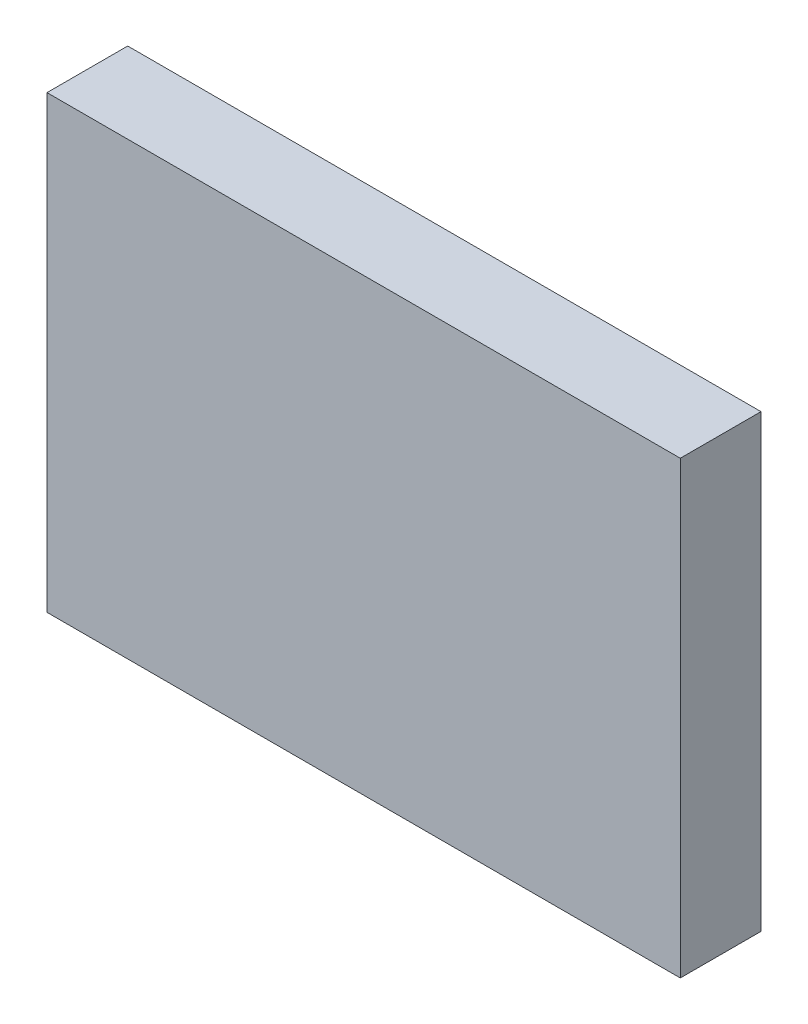
ISO-10303-21;
HEADER;
FILE_DESCRIPTION(('STEP AP214'),'2;1');
FILE_NAME('part.step','',(''),(''),'','','');
FILE_SCHEMA(('AUTOMOTIVE_DESIGN { 1 0 10303 214 1 1 1 1 }'));
ENDSEC;
DATA;
#1=APPLICATION_CONTEXT('core data for automotive mechanical design processes');
#2=APPLICATION_PROTOCOL_DEFINITION('international standard','automotive_design',2000,#1);
#3=PRODUCT_CONTEXT('',#1,'mechanical');
#4=PRODUCT('Part','Part','',(#3));
#5=PRODUCT_RELATED_PRODUCT_CATEGORY('part','',(#4));
#6=PRODUCT_DEFINITION_FORMATION('','',#4);
#7=PRODUCT_DEFINITION_CONTEXT('part definition',#1,'design');
#8=PRODUCT_DEFINITION('design','',#6,#7);
#9=PRODUCT_DEFINITION_SHAPE('','',#8);
#10=(LENGTH_UNIT() NAMED_UNIT(*) SI_UNIT(.MILLI.,.METRE.));
#11=(NAMED_UNIT(*) PLANE_ANGLE_UNIT() SI_UNIT($,.RADIAN.));
#12=(NAMED_UNIT(*) SI_UNIT($,.STERADIAN.) SOLID_ANGLE_UNIT());
#13=UNCERTAINTY_MEASURE_WITH_UNIT(LENGTH_MEASURE(1.E-05),#10,'distance_accuracy_value','');
#14=(GEOMETRIC_REPRESENTATION_CONTEXT(3) GLOBAL_UNCERTAINTY_ASSIGNED_CONTEXT((#13)) GLOBAL_UNIT_ASSIGNED_CONTEXT((#10,
#11,#12)) REPRESENTATION_CONTEXT('',''));
#15=CARTESIAN_POINT('',(0.,0.,0.));
#16=DIRECTION('',(0.,0.,1.));
#17=DIRECTION('',(1.,0.,0.));
#18=AXIS2_PLACEMENT_3D('',#15,#16,#17);
#19=CARTESIAN_POINT('',(0.,0.,2.6));
#20=DIRECTION('',(-1.,0.,0.));
#21=DIRECTION('',(0.,0.,1.));
#22=AXIS2_PLACEMENT_3D('',#19,#20,#21);
#23=PLANE('',#22);
#24=DIRECTION('',(0.,1.,0.));
#25=VECTOR('',#24,1.);
#26=CARTESIAN_POINT('',(0.,0.,0.));
#27=LINE('',#26,#25);
#28=CARTESIAN_POINT('',(0.,0.,0.));
#29=VERTEX_POINT('',#28);
#30=CARTESIAN_POINT('',(0.,14.5,0.));
#31=VERTEX_POINT('',#30);
#32=EDGE_CURVE('E96',#29,#31,#27,.T.);
#33=ORIENTED_EDGE('',*,*,#32,.T.);
#34=DIRECTION('',(0.,0.,-1.));
#35=VECTOR('',#34,1.);
#36=CARTESIAN_POINT('',(0.,14.5,2.6));
#37=LINE('',#36,#35);
#38=CARTESIAN_POINT('',(0.,14.5,2.6));
#39=VERTEX_POINT('',#38);
#40=EDGE_CURVE('E11',#39,#31,#37,.T.);
#41=ORIENTED_EDGE('',*,*,#40,.F.);
#42=DIRECTION('',(0.,1.,0.));
#43=VECTOR('',#42,1.);
#44=CARTESIAN_POINT('',(0.,0.,2.6));
#45=LINE('',#44,#43);
#46=CARTESIAN_POINT('',(0.,0.,2.6));
#47=VERTEX_POINT('',#46);
#48=EDGE_CURVE('E84',#47,#39,#45,.T.);
#49=ORIENTED_EDGE('',*,*,#48,.F.);
#50=DIRECTION('',(0.,0.,-1.));
#51=VECTOR('',#50,1.);
#52=CARTESIAN_POINT('',(0.,0.,2.6));
#53=LINE('',#52,#51);
#54=EDGE_CURVE('E92',#47,#29,#53,.T.);
#55=ORIENTED_EDGE('',*,*,#54,.T.);
#56=EDGE_LOOP('',(#33,#41,#49,#55));
#57=FACE_BOUND('',#56,.T.);
#58=ADVANCED_FACE('F33',(#57),#23,.F.);
#59=CARTESIAN_POINT('',(0.,14.5,2.6));
#60=DIRECTION('',(0.,-1.,0.));
#61=DIRECTION('',(1.,0.,0.));
#62=AXIS2_PLACEMENT_3D('',#59,#60,#61);
#63=PLANE('',#62);
#64=DIRECTION('',(-1.,0.,0.));
#65=VECTOR('',#64,1.);
#66=CARTESIAN_POINT('',(0.,14.5,0.));
#67=LINE('',#66,#65);
#68=CARTESIAN_POINT('',(-20.4,14.5,0.));
#69=VERTEX_POINT('',#68);
#70=EDGE_CURVE('E88',#31,#69,#67,.T.);
#71=ORIENTED_EDGE('',*,*,#70,.T.);
#72=DIRECTION('',(0.,0.,-1.));
#73=VECTOR('',#72,1.);
#74=CARTESIAN_POINT('',(-20.4,14.5,2.6));
#75=LINE('',#74,#73);
#76=CARTESIAN_POINT('',(-20.4,14.5,2.6));
#77=VERTEX_POINT('',#76);
#78=EDGE_CURVE('E41',#77,#69,#75,.T.);
#79=ORIENTED_EDGE('',*,*,#78,.F.);
#80=DIRECTION('',(-1.,0.,0.));
#81=VECTOR('',#80,1.);
#82=CARTESIAN_POINT('',(0.,14.5,2.6));
#83=LINE('',#82,#81);
#84=EDGE_CURVE('E79',#39,#77,#83,.T.);
#85=ORIENTED_EDGE('',*,*,#84,.F.);
#86=ORIENTED_EDGE('',*,*,#40,.T.);
#87=EDGE_LOOP('',(#71,#79,#85,#86));
#88=FACE_BOUND('',#87,.T.);
#89=ADVANCED_FACE('F87',(#88),#63,.F.);
#90=CARTESIAN_POINT('',(-20.4,0.,2.6));
#91=DIRECTION('',(1.,0.,0.));
#92=DIRECTION('',(0.,0.,-1.));
#93=AXIS2_PLACEMENT_3D('',#90,#91,#92);
#94=PLANE('',#93);
#95=DIRECTION('',(0.,-1.,0.));
#96=VECTOR('',#95,1.);
#97=CARTESIAN_POINT('',(-20.4,0.,0.));
#98=LINE('',#97,#96);
#99=CARTESIAN_POINT('',(-20.4,0.,0.));
#100=VERTEX_POINT('',#99);
#101=EDGE_CURVE('E66',#69,#100,#98,.T.);
#102=ORIENTED_EDGE('',*,*,#101,.T.);
#103=DIRECTION('',(0.,0.,-1.));
#104=VECTOR('',#103,1.);
#105=CARTESIAN_POINT('',(-20.4,0.,2.6));
#106=LINE('',#105,#104);
#107=CARTESIAN_POINT('',(-20.4,0.,2.6));
#108=VERTEX_POINT('',#107);
#109=EDGE_CURVE('E89',#108,#100,#106,.T.);
#110=ORIENTED_EDGE('',*,*,#109,.F.);
#111=DIRECTION('',(0.,-1.,0.));
#112=VECTOR('',#111,1.);
#113=CARTESIAN_POINT('',(-20.4,0.,2.6));
#114=LINE('',#113,#112);
#115=EDGE_CURVE('E82',#77,#108,#114,.T.);
#116=ORIENTED_EDGE('',*,*,#115,.F.);
#117=ORIENTED_EDGE('',*,*,#78,.T.);
#118=EDGE_LOOP('',(#102,#110,#116,#117));
#119=FACE_BOUND('',#118,.T.);
#120=ADVANCED_FACE('F90',(#119),#94,.F.);
#121=CARTESIAN_POINT('',(0.,0.,2.6));
#122=DIRECTION('',(0.,1.,0.));
#123=DIRECTION('',(-1.,0.,0.));
#124=AXIS2_PLACEMENT_3D('',#121,#122,#123);
#125=PLANE('',#124);
#126=DIRECTION('',(1.,0.,0.));
#127=VECTOR('',#126,1.);
#128=CARTESIAN_POINT('',(0.,0.,0.));
#129=LINE('',#128,#127);
#130=EDGE_CURVE('E72',#100,#29,#129,.T.);
#131=ORIENTED_EDGE('',*,*,#130,.T.);
#132=ORIENTED_EDGE('',*,*,#54,.F.);
#133=DIRECTION('',(1.,0.,0.));
#134=VECTOR('',#133,1.);
#135=CARTESIAN_POINT('',(0.,0.,2.6));
#136=LINE('',#135,#134);
#137=EDGE_CURVE('E49',#108,#47,#136,.T.);
#138=ORIENTED_EDGE('',*,*,#137,.F.);
#139=ORIENTED_EDGE('',*,*,#109,.T.);
#140=EDGE_LOOP('',(#131,#132,#138,#139));
#141=FACE_BOUND('',#140,.T.);
#142=ADVANCED_FACE('F103',(#141),#125,.F.);
#143=CARTESIAN_POINT('',(0.,0.,2.6));
#144=DIRECTION('',(0.,0.,1.));
#145=DIRECTION('',(1.,0.,0.));
#146=AXIS2_PLACEMENT_3D('',#143,#144,#145);
#147=PLANE('',#146);
#148=ORIENTED_EDGE('',*,*,#48,.T.);
#149=ORIENTED_EDGE('',*,*,#84,.T.);
#150=ORIENTED_EDGE('',*,*,#115,.T.);
#151=ORIENTED_EDGE('',*,*,#137,.T.);
#152=EDGE_LOOP('',(#148,#149,#150,#151));
#153=FACE_BOUND('',#152,.T.);
#154=ADVANCED_FACE('F80',(#153),#147,.T.);
#155=CARTESIAN_POINT('',(0.,0.,0.));
#156=DIRECTION('',(0.,0.,1.));
#157=DIRECTION('',(1.,0.,0.));
#158=AXIS2_PLACEMENT_3D('',#155,#156,#157);
#159=PLANE('',#158);
#160=ORIENTED_EDGE('',*,*,#32,.F.);
#161=ORIENTED_EDGE('',*,*,#130,.F.);
#162=ORIENTED_EDGE('',*,*,#101,.F.);
#163=ORIENTED_EDGE('',*,*,#70,.F.);
#164=EDGE_LOOP('',(#160,#161,#162,#163));
#165=FACE_BOUND('',#164,.T.);
#166=ADVANCED_FACE('F106',(#165),#159,.F.);
#167=CLOSED_SHELL('',(#58,#89,#120,#142,#154,#166));
#168=MANIFOLD_SOLID_BREP('B2',#167);
#169=ADVANCED_BREP_SHAPE_REPRESENTATION('',(#18,#168),#14);
#170=SHAPE_DEFINITION_REPRESENTATION(#9,#169);
ENDSEC;
END-ISO-10303-21;
